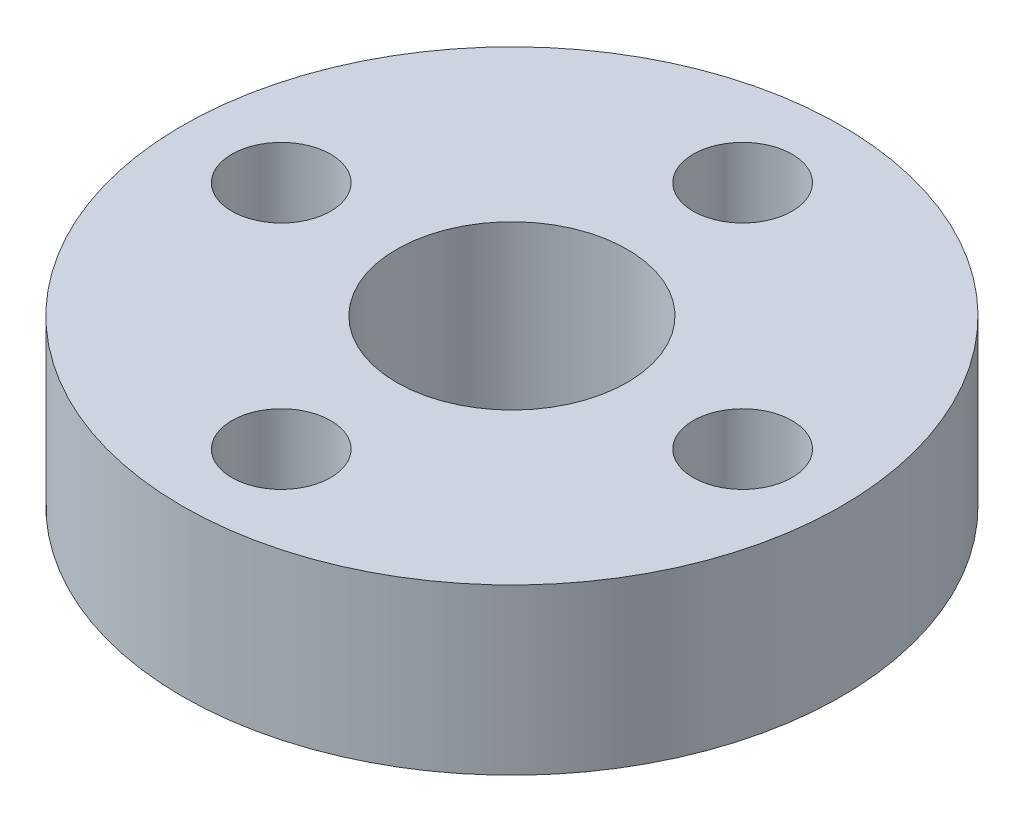
ISO-10303-21;
HEADER;
FILE_DESCRIPTION(('STEP AP214'),'2;1');
FILE_NAME('part.step','',(''),(''),'','','');
FILE_SCHEMA(('AUTOMOTIVE_DESIGN { 1 0 10303 214 1 1 1 1 }'));
ENDSEC;
DATA;
#1=APPLICATION_CONTEXT('core data for automotive mechanical design processes');
#2=APPLICATION_PROTOCOL_DEFINITION('international standard','automotive_design',2000,#1);
#3=PRODUCT_CONTEXT('',#1,'mechanical');
#4=PRODUCT('Part','Part','',(#3));
#5=PRODUCT_RELATED_PRODUCT_CATEGORY('part','',(#4));
#6=PRODUCT_DEFINITION_FORMATION('','',#4);
#7=PRODUCT_DEFINITION_CONTEXT('part definition',#1,'design');
#8=PRODUCT_DEFINITION('design','',#6,#7);
#9=PRODUCT_DEFINITION_SHAPE('','',#8);
#10=(LENGTH_UNIT() NAMED_UNIT(*) SI_UNIT(.MILLI.,.METRE.));
#11=(NAMED_UNIT(*) PLANE_ANGLE_UNIT() SI_UNIT($,.RADIAN.));
#12=(NAMED_UNIT(*) SI_UNIT($,.STERADIAN.) SOLID_ANGLE_UNIT());
#13=UNCERTAINTY_MEASURE_WITH_UNIT(LENGTH_MEASURE(1.E-05),#10,'distance_accuracy_value','');
#14=(GEOMETRIC_REPRESENTATION_CONTEXT(3) GLOBAL_UNCERTAINTY_ASSIGNED_CONTEXT((#13)) GLOBAL_UNIT_ASSIGNED_CONTEXT((#10,
#11,#12)) REPRESENTATION_CONTEXT('',''));
#15=CARTESIAN_POINT('',(0.,0.,0.));
#16=DIRECTION('',(0.,0.,1.));
#17=DIRECTION('',(1.,0.,0.));
#18=AXIS2_PLACEMENT_3D('',#15,#16,#17);
#19=CARTESIAN_POINT('',(0.,5.,0.));
#20=DIRECTION('',(0.,1.,0.));
#21=DIRECTION('',(0.,0.,1.));
#22=AXIS2_PLACEMENT_3D('',#19,#20,#21);
#23=PLANE('',#22);
#24=CARTESIAN_POINT('',(0.,5.,7.));
#25=DIRECTION('',(0.,1.,0.));
#26=DIRECTION('',(0.,0.,-1.));
#27=AXIS2_PLACEMENT_3D('',#24,#25,#26);
#28=CIRCLE('',#27,1.5);
#29=CARTESIAN_POINT('',(0.,5.,5.5));
#30=VERTEX_POINT('',#29);
#31=EDGE_CURVE('E67',#30,#30,#28,.T.);
#32=ORIENTED_EDGE('',*,*,#31,.F.);
#33=EDGE_LOOP('',(#32));
#34=FACE_BOUND('',#33,.T.);
#35=CARTESIAN_POINT('',(7.,5.,0.));
#36=DIRECTION('',(0.,1.,0.));
#37=DIRECTION('',(0.,0.,1.));
#38=AXIS2_PLACEMENT_3D('',#35,#36,#37);
#39=CIRCLE('',#38,1.5);
#40=CARTESIAN_POINT('',(7.,5.,1.5));
#41=VERTEX_POINT('',#40);
#42=EDGE_CURVE('E55',#41,#41,#39,.T.);
#43=ORIENTED_EDGE('',*,*,#42,.F.);
#44=EDGE_LOOP('',(#43));
#45=FACE_BOUND('',#44,.T.);
#46=CARTESIAN_POINT('',(0.,5.,0.));
#47=DIRECTION('',(0.,1.,0.));
#48=DIRECTION('',(0.,0.,1.));
#49=AXIS2_PLACEMENT_3D('',#46,#47,#48);
#50=CIRCLE('',#49,10.);
#51=CARTESIAN_POINT('',(0.,5.,10.));
#52=VERTEX_POINT('',#51);
#53=EDGE_CURVE('E10',#52,#52,#50,.T.);
#54=ORIENTED_EDGE('',*,*,#53,.T.);
#55=EDGE_LOOP('',(#54));
#56=FACE_BOUND('',#55,.T.);
#57=CARTESIAN_POINT('',(0.,5.,-7.));
#58=DIRECTION('',(0.,1.,0.));
#59=DIRECTION('',(0.,0.,1.));
#60=AXIS2_PLACEMENT_3D('',#57,#58,#59);
#61=CIRCLE('',#60,1.5);
#62=CARTESIAN_POINT('',(0.,5.,-5.5));
#63=VERTEX_POINT('',#62);
#64=EDGE_CURVE('E50',#63,#63,#61,.T.);
#65=ORIENTED_EDGE('',*,*,#64,.F.);
#66=EDGE_LOOP('',(#65));
#67=FACE_BOUND('',#66,.T.);
#68=CARTESIAN_POINT('',(0.,5.,0.));
#69=DIRECTION('',(0.,1.,0.));
#70=DIRECTION('',(0.,0.,1.));
#71=AXIS2_PLACEMENT_3D('',#68,#69,#70);
#72=CIRCLE('',#71,3.5);
#73=CARTESIAN_POINT('',(0.,5.,3.5));
#74=VERTEX_POINT('',#73);
#75=EDGE_CURVE('E61',#74,#74,#72,.T.);
#76=ORIENTED_EDGE('',*,*,#75,.F.);
#77=EDGE_LOOP('',(#76));
#78=FACE_BOUND('',#77,.T.);
#79=CARTESIAN_POINT('',(-7.,5.,0.));
#80=DIRECTION('',(0.,1.,0.));
#81=DIRECTION('',(0.,0.,-1.));
#82=AXIS2_PLACEMENT_3D('',#79,#80,#81);
#83=CIRCLE('',#82,1.5);
#84=CARTESIAN_POINT('',(-7.,5.,-1.5));
#85=VERTEX_POINT('',#84);
#86=EDGE_CURVE('E73',#85,#85,#83,.T.);
#87=ORIENTED_EDGE('',*,*,#86,.F.);
#88=EDGE_LOOP('',(#87));
#89=FACE_BOUND('',#88,.T.);
#90=ADVANCED_FACE('F39',(#34,#45,#56,#67,#78,#89),#23,.T.);
#91=CARTESIAN_POINT('',(0.,0.,0.));
#92=DIRECTION('',(0.,1.,0.));
#93=DIRECTION('',(0.,0.,1.));
#94=AXIS2_PLACEMENT_3D('',#91,#92,#93);
#95=PLANE('',#94);
#96=CARTESIAN_POINT('',(0.,0.,0.));
#97=DIRECTION('',(0.,1.,0.));
#98=DIRECTION('',(0.,0.,1.));
#99=AXIS2_PLACEMENT_3D('',#96,#97,#98);
#100=CIRCLE('',#99,10.);
#101=CARTESIAN_POINT('',(0.,0.,10.));
#102=VERTEX_POINT('',#101);
#103=EDGE_CURVE('E43',#102,#102,#100,.T.);
#104=ORIENTED_EDGE('',*,*,#103,.F.);
#105=EDGE_LOOP('',(#104));
#106=FACE_BOUND('',#105,.T.);
#107=CARTESIAN_POINT('',(0.,0.,-7.));
#108=DIRECTION('',(0.,1.,0.));
#109=DIRECTION('',(0.,0.,1.));
#110=AXIS2_PLACEMENT_3D('',#107,#108,#109);
#111=CIRCLE('',#110,1.5);
#112=CARTESIAN_POINT('',(0.,0.,-5.5));
#113=VERTEX_POINT('',#112);
#114=EDGE_CURVE('E52',#113,#113,#111,.T.);
#115=ORIENTED_EDGE('',*,*,#114,.T.);
#116=EDGE_LOOP('',(#115));
#117=FACE_BOUND('',#116,.T.);
#118=CARTESIAN_POINT('',(7.,0.,0.));
#119=DIRECTION('',(0.,1.,0.));
#120=DIRECTION('',(0.,0.,1.));
#121=AXIS2_PLACEMENT_3D('',#118,#119,#120);
#122=CIRCLE('',#121,1.5);
#123=CARTESIAN_POINT('',(7.,0.,1.5));
#124=VERTEX_POINT('',#123);
#125=EDGE_CURVE('E58',#124,#124,#122,.T.);
#126=ORIENTED_EDGE('',*,*,#125,.T.);
#127=EDGE_LOOP('',(#126));
#128=FACE_BOUND('',#127,.T.);
#129=CARTESIAN_POINT('',(0.,0.,0.));
#130=DIRECTION('',(0.,1.,0.));
#131=DIRECTION('',(0.,0.,1.));
#132=AXIS2_PLACEMENT_3D('',#129,#130,#131);
#133=CIRCLE('',#132,3.5);
#134=CARTESIAN_POINT('',(0.,0.,3.5));
#135=VERTEX_POINT('',#134);
#136=EDGE_CURVE('E64',#135,#135,#133,.T.);
#137=ORIENTED_EDGE('',*,*,#136,.T.);
#138=EDGE_LOOP('',(#137));
#139=FACE_BOUND('',#138,.T.);
#140=CARTESIAN_POINT('',(0.,0.,7.));
#141=DIRECTION('',(0.,1.,0.));
#142=DIRECTION('',(0.,0.,-1.));
#143=AXIS2_PLACEMENT_3D('',#140,#141,#142);
#144=CIRCLE('',#143,1.5);
#145=CARTESIAN_POINT('',(0.,0.,5.5));
#146=VERTEX_POINT('',#145);
#147=EDGE_CURVE('E70',#146,#146,#144,.T.);
#148=ORIENTED_EDGE('',*,*,#147,.T.);
#149=EDGE_LOOP('',(#148));
#150=FACE_BOUND('',#149,.T.);
#151=CARTESIAN_POINT('',(-7.,0.,0.));
#152=DIRECTION('',(0.,1.,0.));
#153=DIRECTION('',(0.,0.,-1.));
#154=AXIS2_PLACEMENT_3D('',#151,#152,#153);
#155=CIRCLE('',#154,1.5);
#156=CARTESIAN_POINT('',(-7.,0.,-1.5));
#157=VERTEX_POINT('',#156);
#158=EDGE_CURVE('E76',#157,#157,#155,.T.);
#159=ORIENTED_EDGE('',*,*,#158,.T.);
#160=EDGE_LOOP('',(#159));
#161=FACE_BOUND('',#160,.T.);
#162=ADVANCED_FACE('F86',(#106,#117,#128,#139,#150,#161),#95,.F.);
#163=CARTESIAN_POINT('',(0.,5.,0.));
#164=DIRECTION('',(0.,-1.,0.));
#165=DIRECTION('',(0.,0.,-1.));
#166=AXIS2_PLACEMENT_3D('',#163,#164,#165);
#167=CYLINDRICAL_SURFACE('',#166,10.);
#168=ORIENTED_EDGE('',*,*,#53,.F.);
#169=EDGE_LOOP('',(#168));
#170=FACE_BOUND('',#169,.T.);
#171=ORIENTED_EDGE('',*,*,#103,.T.);
#172=EDGE_LOOP('',(#171));
#173=FACE_BOUND('',#172,.T.);
#174=ADVANCED_FACE('F41',(#170,#173),#167,.T.);
#175=CARTESIAN_POINT('',(0.,5.,-7.));
#176=DIRECTION('',(0.,-1.,0.));
#177=DIRECTION('',(0.,0.,-1.));
#178=AXIS2_PLACEMENT_3D('',#175,#176,#177);
#179=CYLINDRICAL_SURFACE('',#178,1.5);
#180=ORIENTED_EDGE('',*,*,#64,.T.);
#181=EDGE_LOOP('',(#180));
#182=FACE_BOUND('',#181,.T.);
#183=ORIENTED_EDGE('',*,*,#114,.F.);
#184=EDGE_LOOP('',(#183));
#185=FACE_BOUND('',#184,.T.);
#186=ADVANCED_FACE('F96',(#182,#185),#179,.F.);
#187=CARTESIAN_POINT('',(7.,5.,0.));
#188=DIRECTION('',(0.,-1.,0.));
#189=DIRECTION('',(0.,0.,-1.));
#190=AXIS2_PLACEMENT_3D('',#187,#188,#189);
#191=CYLINDRICAL_SURFACE('',#190,1.5);
#192=ORIENTED_EDGE('',*,*,#42,.T.);
#193=EDGE_LOOP('',(#192));
#194=FACE_BOUND('',#193,.T.);
#195=ORIENTED_EDGE('',*,*,#125,.F.);
#196=EDGE_LOOP('',(#195));
#197=FACE_BOUND('',#196,.T.);
#198=ADVANCED_FACE('F99',(#194,#197),#191,.F.);
#199=CARTESIAN_POINT('',(0.,5.,0.));
#200=DIRECTION('',(0.,-1.,0.));
#201=DIRECTION('',(0.,0.,-1.));
#202=AXIS2_PLACEMENT_3D('',#199,#200,#201);
#203=CYLINDRICAL_SURFACE('',#202,3.5);
#204=ORIENTED_EDGE('',*,*,#75,.T.);
#205=EDGE_LOOP('',(#204));
#206=FACE_BOUND('',#205,.T.);
#207=ORIENTED_EDGE('',*,*,#136,.F.);
#208=EDGE_LOOP('',(#207));
#209=FACE_BOUND('',#208,.T.);
#210=ADVANCED_FACE('F103',(#206,#209),#203,.F.);
#211=CARTESIAN_POINT('',(0.,5.,7.));
#212=DIRECTION('',(0.,-1.,0.));
#213=DIRECTION('',(0.,0.,-1.));
#214=AXIS2_PLACEMENT_3D('',#211,#212,#213);
#215=CYLINDRICAL_SURFACE('',#214,1.5);
#216=ORIENTED_EDGE('',*,*,#31,.T.);
#217=EDGE_LOOP('',(#216));
#218=FACE_BOUND('',#217,.T.);
#219=ORIENTED_EDGE('',*,*,#147,.F.);
#220=EDGE_LOOP('',(#219));
#221=FACE_BOUND('',#220,.T.);
#222=ADVANCED_FACE('F107',(#218,#221),#215,.F.);
#223=CARTESIAN_POINT('',(-7.,5.,0.));
#224=DIRECTION('',(0.,-1.,0.));
#225=DIRECTION('',(0.,0.,-1.));
#226=AXIS2_PLACEMENT_3D('',#223,#224,#225);
#227=CYLINDRICAL_SURFACE('',#226,1.5);
#228=ORIENTED_EDGE('',*,*,#86,.T.);
#229=EDGE_LOOP('',(#228));
#230=FACE_BOUND('',#229,.T.);
#231=ORIENTED_EDGE('',*,*,#158,.F.);
#232=EDGE_LOOP('',(#231));
#233=FACE_BOUND('',#232,.T.);
#234=ADVANCED_FACE('F82',(#230,#233),#227,.F.);
#235=CLOSED_SHELL('',(#90,#162,#174,#186,#198,#210,#222,#234));
#236=MANIFOLD_SOLID_BREP('B2',#235);
#237=ADVANCED_BREP_SHAPE_REPRESENTATION('',(#18,#236),#14);
#238=SHAPE_DEFINITION_REPRESENTATION(#9,#237);
ENDSEC;
END-ISO-10303-21;
